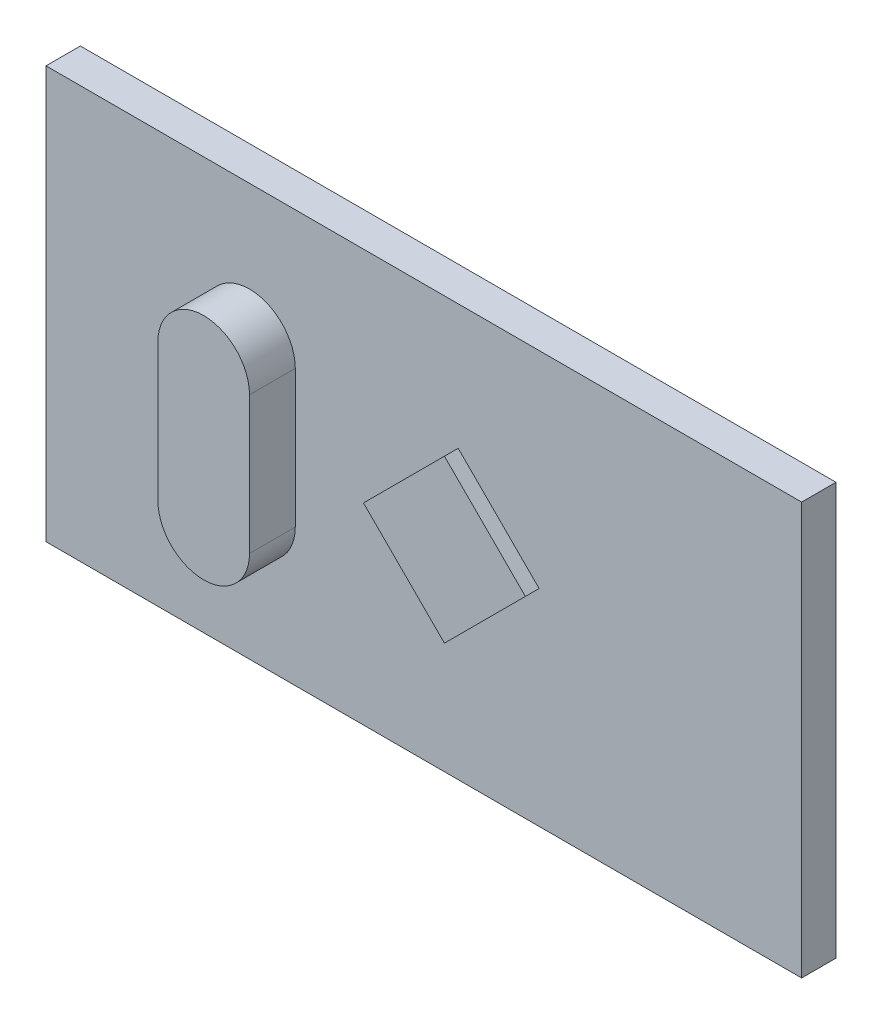
ISO-10303-21;
HEADER;
FILE_DESCRIPTION(('STEP AP214'),'2;1');
FILE_NAME('part.step','',(''),(''),'','','');
FILE_SCHEMA(('AUTOMOTIVE_DESIGN { 1 0 10303 214 1 1 1 1 }'));
ENDSEC;
DATA;
#1=APPLICATION_CONTEXT('core data for automotive mechanical design processes');
#2=APPLICATION_PROTOCOL_DEFINITION('international standard','automotive_design',2000,#1);
#3=PRODUCT_CONTEXT('',#1,'mechanical');
#4=PRODUCT('Part','Part','',(#3));
#5=PRODUCT_RELATED_PRODUCT_CATEGORY('part','',(#4));
#6=PRODUCT_DEFINITION_FORMATION('','',#4);
#7=PRODUCT_DEFINITION_CONTEXT('part definition',#1,'design');
#8=PRODUCT_DEFINITION('design','',#6,#7);
#9=PRODUCT_DEFINITION_SHAPE('','',#8);
#10=(LENGTH_UNIT() NAMED_UNIT(*) SI_UNIT(.MILLI.,.METRE.));
#11=(NAMED_UNIT(*) PLANE_ANGLE_UNIT() SI_UNIT($,.RADIAN.));
#12=(NAMED_UNIT(*) SI_UNIT($,.STERADIAN.) SOLID_ANGLE_UNIT());
#13=UNCERTAINTY_MEASURE_WITH_UNIT(LENGTH_MEASURE(1.E-05),#10,'distance_accuracy_value','');
#14=(GEOMETRIC_REPRESENTATION_CONTEXT(3) GLOBAL_UNCERTAINTY_ASSIGNED_CONTEXT((#13)) GLOBAL_UNIT_ASSIGNED_CONTEXT((#10,
#11,#12)) REPRESENTATION_CONTEXT('',''));
#15=CARTESIAN_POINT('',(0.,0.,0.));
#16=DIRECTION('',(0.,0.,1.));
#17=DIRECTION('',(1.,0.,0.));
#18=AXIS2_PLACEMENT_3D('',#15,#16,#17);
#19=CARTESIAN_POINT('',(0.,0.,1.5));
#20=DIRECTION('',(0.,0.,-1.));
#21=DIRECTION('',(-1.,0.,0.));
#22=AXIS2_PLACEMENT_3D('',#19,#20,#21);
#23=PLANE('',#22);
#24=DIRECTION('',(0.707106781186545,-0.70710678118655,0.));
#25=VECTOR('',#24,1.);
#26=CARTESIAN_POINT('',(18.,5.46446609406721,1.5));
#27=LINE('',#26,#25);
#28=CARTESIAN_POINT('',(14.4644660940672,8.99999999999996,1.5));
#29=VERTEX_POINT('',#28);
#30=CARTESIAN_POINT('',(18.,5.46446609406721,1.5));
#31=VERTEX_POINT('',#30);
#32=EDGE_CURVE('E145',#29,#31,#27,.T.);
#33=ORIENTED_EDGE('',*,*,#32,.F.);
#34=DIRECTION('',(-0.707106781186551,-0.707106781186544,0.));
#35=VECTOR('',#34,1.);
#36=CARTESIAN_POINT('',(14.4644660940672,8.99999999999996,1.5));
#37=LINE('',#36,#35);
#38=CARTESIAN_POINT('',(18.,12.5355339059327,1.5));
#39=VERTEX_POINT('',#38);
#40=EDGE_CURVE('E158',#39,#29,#37,.T.);
#41=ORIENTED_EDGE('',*,*,#40,.F.);
#42=DIRECTION('',(-0.707106781186544,0.70710678118655,0.));
#43=VECTOR('',#42,1.);
#44=CARTESIAN_POINT('',(18.,12.5355339059327,1.5));
#45=LINE('',#44,#43);
#46=CARTESIAN_POINT('',(21.5355339059327,8.99999999999993,1.5));
#47=VERTEX_POINT('',#46);
#48=EDGE_CURVE('E167',#47,#39,#45,.T.);
#49=ORIENTED_EDGE('',*,*,#48,.F.);
#50=DIRECTION('',(0.70710678118655,0.707106781186545,0.));
#51=VECTOR('',#50,1.);
#52=CARTESIAN_POINT('',(21.5355339059327,8.99999999999993,1.5));
#53=LINE('',#52,#51);
#54=EDGE_CURVE('E148',#31,#47,#53,.T.);
#55=ORIENTED_EDGE('',*,*,#54,.F.);
#56=EDGE_LOOP('',(#33,#41,#49,#55));
#57=FACE_BOUND('',#56,.T.);
#58=DIRECTION('',(0.,-1.,0.));
#59=VECTOR('',#58,1.);
#60=CARTESIAN_POINT('',(0.,0.,1.5));
#61=LINE('',#60,#59);
#62=CARTESIAN_POINT('',(0.,18.,1.5));
#63=VERTEX_POINT('',#62);
#64=CARTESIAN_POINT('',(0.,0.,1.5));
#65=VERTEX_POINT('',#64);
#66=EDGE_CURVE('E184',#63,#65,#61,.T.);
#67=ORIENTED_EDGE('',*,*,#66,.T.);
#68=DIRECTION('',(1.,0.,0.));
#69=VECTOR('',#68,1.);
#70=CARTESIAN_POINT('',(0.,0.,1.5));
#71=LINE('',#70,#69);
#72=CARTESIAN_POINT('',(33.,0.,1.5));
#73=VERTEX_POINT('',#72);
#74=EDGE_CURVE('E187',#65,#73,#71,.T.);
#75=ORIENTED_EDGE('',*,*,#74,.T.);
#76=DIRECTION('',(0.,1.,0.));
#77=VECTOR('',#76,1.);
#78=CARTESIAN_POINT('',(33.,0.,1.5));
#79=LINE('',#78,#77);
#80=CARTESIAN_POINT('',(33.,18.,1.5));
#81=VERTEX_POINT('',#80);
#82=EDGE_CURVE('E190',#73,#81,#79,.T.);
#83=ORIENTED_EDGE('',*,*,#82,.T.);
#84=DIRECTION('',(-1.,0.,0.));
#85=VECTOR('',#84,1.);
#86=CARTESIAN_POINT('',(0.,18.,1.5));
#87=LINE('',#86,#85);
#88=EDGE_CURVE('E192',#81,#63,#87,.T.);
#89=ORIENTED_EDGE('',*,*,#88,.T.);
#90=EDGE_LOOP('',(#67,#75,#83,#89));
#91=FACE_BOUND('',#90,.T.);
#92=CARTESIAN_POINT('',(8.88629291200393,6.,1.5));
#93=DIRECTION('',(0.,0.,1.));
#94=DIRECTION('',(1.,0.,0.));
#95=AXIS2_PLACEMENT_3D('',#92,#93,#94);
#96=CIRCLE('',#95,2.);
#97=CARTESIAN_POINT('',(6.88629291200393,6.,1.5));
#98=VERTEX_POINT('',#97);
#99=CARTESIAN_POINT('',(10.8862929120039,6.,1.5));
#100=VERTEX_POINT('',#99);
#101=EDGE_CURVE('E144',#98,#100,#96,.T.);
#102=ORIENTED_EDGE('',*,*,#101,.F.);
#103=DIRECTION('',(0.,-1.,0.));
#104=VECTOR('',#103,1.);
#105=CARTESIAN_POINT('',(6.88629291200393,6.,1.5));
#106=LINE('',#105,#104);
#107=CARTESIAN_POINT('',(6.88629291200393,12.,1.5));
#108=VERTEX_POINT('',#107);
#109=EDGE_CURVE('E141',#108,#98,#106,.T.);
#110=ORIENTED_EDGE('',*,*,#109,.F.);
#111=CARTESIAN_POINT('',(8.88629291200393,12.,1.5));
#112=DIRECTION('',(0.,0.,1.));
#113=DIRECTION('',(1.,0.,0.));
#114=AXIS2_PLACEMENT_3D('',#111,#112,#113);
#115=CIRCLE('',#114,2.);
#116=CARTESIAN_POINT('',(10.8862929120039,12.,1.5));
#117=VERTEX_POINT('',#116);
#118=EDGE_CURVE('E55',#117,#108,#115,.T.);
#119=ORIENTED_EDGE('',*,*,#118,.F.);
#120=DIRECTION('',(0.,1.,0.));
#121=VECTOR('',#120,1.);
#122=CARTESIAN_POINT('',(10.8862929120039,6.,1.5));
#123=LINE('',#122,#121);
#124=EDGE_CURVE('E50',#100,#117,#123,.T.);
#125=ORIENTED_EDGE('',*,*,#124,.F.);
#126=EDGE_LOOP('',(#102,#110,#119,#125));
#127=FACE_BOUND('',#126,.T.);
#128=ADVANCED_FACE('F35',(#57,#91,#127),#23,.F.);
#129=CARTESIAN_POINT('',(0.,0.,1.5));
#130=DIRECTION('',(1.,0.,0.));
#131=DIRECTION('',(0.,0.,-1.));
#132=AXIS2_PLACEMENT_3D('',#129,#130,#131);
#133=PLANE('',#132);
#134=DIRECTION('',(0.,-1.,0.));
#135=VECTOR('',#134,1.);
#136=CARTESIAN_POINT('',(0.,0.,0.));
#137=LINE('',#136,#135);
#138=CARTESIAN_POINT('',(0.,18.,0.));
#139=VERTEX_POINT('',#138);
#140=CARTESIAN_POINT('',(0.,0.,0.));
#141=VERTEX_POINT('',#140);
#142=EDGE_CURVE('E183',#139,#141,#137,.T.);
#143=ORIENTED_EDGE('',*,*,#142,.T.);
#144=DIRECTION('',(0.,0.,-1.));
#145=VECTOR('',#144,1.);
#146=CARTESIAN_POINT('',(0.,0.,1.5));
#147=LINE('',#146,#145);
#148=EDGE_CURVE('E11',#65,#141,#147,.T.);
#149=ORIENTED_EDGE('',*,*,#148,.F.);
#150=ORIENTED_EDGE('',*,*,#66,.F.);
#151=DIRECTION('',(0.,0.,-1.));
#152=VECTOR('',#151,1.);
#153=CARTESIAN_POINT('',(0.,18.,1.5));
#154=LINE('',#153,#152);
#155=EDGE_CURVE('E194',#63,#139,#154,.T.);
#156=ORIENTED_EDGE('',*,*,#155,.T.);
#157=EDGE_LOOP('',(#143,#149,#150,#156));
#158=FACE_BOUND('',#157,.T.);
#159=ADVANCED_FACE('F37',(#158),#133,.F.);
#160=CARTESIAN_POINT('',(0.,0.,1.5));
#161=DIRECTION('',(0.,1.,0.));
#162=DIRECTION('',(0.,0.,1.));
#163=AXIS2_PLACEMENT_3D('',#160,#161,#162);
#164=PLANE('',#163);
#165=DIRECTION('',(1.,0.,0.));
#166=VECTOR('',#165,1.);
#167=CARTESIAN_POINT('',(0.,0.,0.));
#168=LINE('',#167,#166);
#169=CARTESIAN_POINT('',(33.,0.,0.));
#170=VERTEX_POINT('',#169);
#171=EDGE_CURVE('E197',#141,#170,#168,.T.);
#172=ORIENTED_EDGE('',*,*,#171,.T.);
#173=DIRECTION('',(0.,0.,-1.));
#174=VECTOR('',#173,1.);
#175=CARTESIAN_POINT('',(33.,0.,1.5));
#176=LINE('',#175,#174);
#177=EDGE_CURVE('E43',#73,#170,#176,.T.);
#178=ORIENTED_EDGE('',*,*,#177,.F.);
#179=ORIENTED_EDGE('',*,*,#74,.F.);
#180=ORIENTED_EDGE('',*,*,#148,.T.);
#181=EDGE_LOOP('',(#172,#178,#179,#180));
#182=FACE_BOUND('',#181,.T.);
#183=ADVANCED_FACE('F226',(#182),#164,.F.);
#184=CARTESIAN_POINT('',(33.,0.,1.5));
#185=DIRECTION('',(-1.,0.,0.));
#186=DIRECTION('',(0.,0.,1.));
#187=AXIS2_PLACEMENT_3D('',#184,#185,#186);
#188=PLANE('',#187);
#189=DIRECTION('',(0.,1.,0.));
#190=VECTOR('',#189,1.);
#191=CARTESIAN_POINT('',(33.,0.,0.));
#192=LINE('',#191,#190);
#193=CARTESIAN_POINT('',(33.,18.,0.));
#194=VERTEX_POINT('',#193);
#195=EDGE_CURVE('E199',#170,#194,#192,.T.);
#196=ORIENTED_EDGE('',*,*,#195,.T.);
#197=DIRECTION('',(0.,0.,-1.));
#198=VECTOR('',#197,1.);
#199=CARTESIAN_POINT('',(33.,18.,1.5));
#200=LINE('',#199,#198);
#201=EDGE_CURVE('E204',#81,#194,#200,.T.);
#202=ORIENTED_EDGE('',*,*,#201,.F.);
#203=ORIENTED_EDGE('',*,*,#82,.F.);
#204=ORIENTED_EDGE('',*,*,#177,.T.);
#205=EDGE_LOOP('',(#196,#202,#203,#204));
#206=FACE_BOUND('',#205,.T.);
#207=ADVANCED_FACE('F211',(#206),#188,.F.);
#208=CARTESIAN_POINT('',(0.,18.,1.5));
#209=DIRECTION('',(0.,-1.,0.));
#210=DIRECTION('',(0.,0.,-1.));
#211=AXIS2_PLACEMENT_3D('',#208,#209,#210);
#212=PLANE('',#211);
#213=DIRECTION('',(-1.,0.,0.));
#214=VECTOR('',#213,1.);
#215=CARTESIAN_POINT('',(0.,18.,0.));
#216=LINE('',#215,#214);
#217=EDGE_CURVE('E188',#194,#139,#216,.T.);
#218=ORIENTED_EDGE('',*,*,#217,.T.);
#219=ORIENTED_EDGE('',*,*,#155,.F.);
#220=ORIENTED_EDGE('',*,*,#88,.F.);
#221=ORIENTED_EDGE('',*,*,#201,.T.);
#222=EDGE_LOOP('',(#218,#219,#220,#221));
#223=FACE_BOUND('',#222,.T.);
#224=ADVANCED_FACE('F220',(#223),#212,.F.);
#225=CARTESIAN_POINT('',(0.,0.,0.));
#226=DIRECTION('',(0.,0.,-1.));
#227=DIRECTION('',(-1.,0.,0.));
#228=AXIS2_PLACEMENT_3D('',#225,#226,#227);
#229=PLANE('',#228);
#230=ORIENTED_EDGE('',*,*,#142,.F.);
#231=ORIENTED_EDGE('',*,*,#217,.F.);
#232=ORIENTED_EDGE('',*,*,#195,.F.);
#233=ORIENTED_EDGE('',*,*,#171,.F.);
#234=EDGE_LOOP('',(#230,#231,#232,#233));
#235=FACE_BOUND('',#234,.T.);
#236=ADVANCED_FACE('F217',(#235),#229,.T.);
#237=CARTESIAN_POINT('',(18.,5.46446609406721,2.1));
#238=DIRECTION('',(0.70710678118655,0.707106781186545,0.));
#239=DIRECTION('',(-0.707106781186545,0.70710678118655,0.));
#240=AXIS2_PLACEMENT_3D('',#237,#238,#239);
#241=PLANE('',#240);
#242=ORIENTED_EDGE('',*,*,#32,.T.);
#243=DIRECTION('',(0.,0.,-1.));
#244=VECTOR('',#243,1.);
#245=CARTESIAN_POINT('',(18.,5.46446609406721,2.1));
#246=LINE('',#245,#244);
#247=CARTESIAN_POINT('',(18.,5.46446609406721,2.1));
#248=VERTEX_POINT('',#247);
#249=EDGE_CURVE('E180',#248,#31,#246,.T.);
#250=ORIENTED_EDGE('',*,*,#249,.F.);
#251=DIRECTION('',(0.707106781186545,-0.70710678118655,0.));
#252=VECTOR('',#251,1.);
#253=CARTESIAN_POINT('',(18.,5.46446609406721,2.1));
#254=LINE('',#253,#252);
#255=CARTESIAN_POINT('',(14.4644660940672,8.99999999999996,2.1));
#256=VERTEX_POINT('',#255);
#257=EDGE_CURVE('E154',#256,#248,#254,.T.);
#258=ORIENTED_EDGE('',*,*,#257,.F.);
#259=DIRECTION('',(0.,0.,-1.));
#260=VECTOR('',#259,1.);
#261=CARTESIAN_POINT('',(14.4644660940672,8.99999999999996,2.1));
#262=LINE('',#261,#260);
#263=EDGE_CURVE('E163',#256,#29,#262,.T.);
#264=ORIENTED_EDGE('',*,*,#263,.T.);
#265=EDGE_LOOP('',(#242,#250,#258,#264));
#266=FACE_BOUND('',#265,.T.);
#267=ADVANCED_FACE('F240',(#266),#241,.F.);
#268=CARTESIAN_POINT('',(21.5355339059327,8.99999999999993,2.1));
#269=DIRECTION('',(-0.707106781186545,0.70710678118655,0.));
#270=DIRECTION('',(-0.70710678118655,-0.707106781186545,0.));
#271=AXIS2_PLACEMENT_3D('',#268,#269,#270);
#272=PLANE('',#271);
#273=ORIENTED_EDGE('',*,*,#54,.T.);
#274=DIRECTION('',(0.,0.,-1.));
#275=VECTOR('',#274,1.);
#276=CARTESIAN_POINT('',(21.5355339059327,8.99999999999993,2.1));
#277=LINE('',#276,#275);
#278=CARTESIAN_POINT('',(21.5355339059327,8.99999999999993,2.1));
#279=VERTEX_POINT('',#278);
#280=EDGE_CURVE('E177',#279,#47,#277,.T.);
#281=ORIENTED_EDGE('',*,*,#280,.F.);
#282=DIRECTION('',(0.70710678118655,0.707106781186545,0.));
#283=VECTOR('',#282,1.);
#284=CARTESIAN_POINT('',(21.5355339059327,8.99999999999993,2.1));
#285=LINE('',#284,#283);
#286=EDGE_CURVE('E157',#248,#279,#285,.T.);
#287=ORIENTED_EDGE('',*,*,#286,.F.);
#288=ORIENTED_EDGE('',*,*,#249,.T.);
#289=EDGE_LOOP('',(#273,#281,#287,#288));
#290=FACE_BOUND('',#289,.T.);
#291=ADVANCED_FACE('F260',(#290),#272,.F.);
#292=CARTESIAN_POINT('',(18.,12.5355339059327,2.1));
#293=DIRECTION('',(-0.707106781186551,-0.707106781186545,0.));
#294=DIRECTION('',(0.707106781186545,-0.70710678118655,0.));
#295=AXIS2_PLACEMENT_3D('',#292,#293,#294);
#296=PLANE('',#295);
#297=ORIENTED_EDGE('',*,*,#48,.T.);
#298=DIRECTION('',(0.,0.,-1.));
#299=VECTOR('',#298,1.);
#300=CARTESIAN_POINT('',(18.,12.5355339059327,2.1));
#301=LINE('',#300,#299);
#302=CARTESIAN_POINT('',(18.,12.5355339059327,2.1));
#303=VERTEX_POINT('',#302);
#304=EDGE_CURVE('E174',#303,#39,#301,.T.);
#305=ORIENTED_EDGE('',*,*,#304,.F.);
#306=DIRECTION('',(-0.707106781186544,0.70710678118655,0.));
#307=VECTOR('',#306,1.);
#308=CARTESIAN_POINT('',(18.,12.5355339059327,2.1));
#309=LINE('',#308,#307);
#310=EDGE_CURVE('E160',#279,#303,#309,.T.);
#311=ORIENTED_EDGE('',*,*,#310,.F.);
#312=ORIENTED_EDGE('',*,*,#280,.T.);
#313=EDGE_LOOP('',(#297,#305,#311,#312));
#314=FACE_BOUND('',#313,.T.);
#315=ADVANCED_FACE('F267',(#314),#296,.F.);
#316=CARTESIAN_POINT('',(14.4644660940672,8.99999999999996,2.1));
#317=DIRECTION('',(0.707106781186544,-0.707106781186551,0.));
#318=DIRECTION('',(0.707106781186551,0.707106781186544,0.));
#319=AXIS2_PLACEMENT_3D('',#316,#317,#318);
#320=PLANE('',#319);
#321=ORIENTED_EDGE('',*,*,#40,.T.);
#322=ORIENTED_EDGE('',*,*,#263,.F.);
#323=DIRECTION('',(-0.707106781186551,-0.707106781186544,0.));
#324=VECTOR('',#323,1.);
#325=CARTESIAN_POINT('',(14.4644660940672,8.99999999999996,2.1));
#326=LINE('',#325,#324);
#327=EDGE_CURVE('E162',#303,#256,#326,.T.);
#328=ORIENTED_EDGE('',*,*,#327,.F.);
#329=ORIENTED_EDGE('',*,*,#304,.T.);
#330=EDGE_LOOP('',(#321,#322,#328,#329));
#331=FACE_BOUND('',#330,.T.);
#332=ADVANCED_FACE('F274',(#331),#320,.F.);
#333=CARTESIAN_POINT('',(0.,0.,2.1));
#334=DIRECTION('',(0.,0.,-1.));
#335=DIRECTION('',(-1.,0.,0.));
#336=AXIS2_PLACEMENT_3D('',#333,#334,#335);
#337=PLANE('',#336);
#338=ORIENTED_EDGE('',*,*,#257,.T.);
#339=ORIENTED_EDGE('',*,*,#286,.T.);
#340=ORIENTED_EDGE('',*,*,#310,.T.);
#341=ORIENTED_EDGE('',*,*,#327,.T.);
#342=EDGE_LOOP('',(#338,#339,#340,#341));
#343=FACE_BOUND('',#342,.T.);
#344=ADVANCED_FACE('F282',(#343),#337,.F.);
#345=CARTESIAN_POINT('',(8.88629291200393,6.,3.5));
#346=DIRECTION('',(0.,0.,-1.));
#347=DIRECTION('',(-1.,0.,0.));
#348=AXIS2_PLACEMENT_3D('',#345,#346,#347);
#349=CYLINDRICAL_SURFACE('',#348,2.);
#350=ORIENTED_EDGE('',*,*,#101,.T.);
#351=DIRECTION('',(0.,0.,-1.));
#352=VECTOR('',#351,1.);
#353=CARTESIAN_POINT('',(10.8862929120039,6.,3.5));
#354=LINE('',#353,#352);
#355=CARTESIAN_POINT('',(10.8862929120039,6.,3.5));
#356=VERTEX_POINT('',#355);
#357=EDGE_CURVE('E125',#356,#100,#354,.T.);
#358=ORIENTED_EDGE('',*,*,#357,.F.);
#359=CARTESIAN_POINT('',(8.88629291200393,6.,3.5));
#360=DIRECTION('',(0.,0.,1.));
#361=DIRECTION('',(1.,0.,0.));
#362=AXIS2_PLACEMENT_3D('',#359,#360,#361);
#363=CIRCLE('',#362,2.);
#364=CARTESIAN_POINT('',(6.88629291200393,6.,3.5));
#365=VERTEX_POINT('',#364);
#366=EDGE_CURVE('E132',#365,#356,#363,.T.);
#367=ORIENTED_EDGE('',*,*,#366,.F.);
#368=DIRECTION('',(0.,0.,-1.));
#369=VECTOR('',#368,1.);
#370=CARTESIAN_POINT('',(6.88629291200393,6.,3.5));
#371=LINE('',#370,#369);
#372=EDGE_CURVE('E384',#365,#98,#371,.T.);
#373=ORIENTED_EDGE('',*,*,#372,.T.);
#374=EDGE_LOOP('',(#350,#358,#367,#373));
#375=FACE_BOUND('',#374,.T.);
#376=ADVANCED_FACE('F143',(#375),#349,.T.);
#377=CARTESIAN_POINT('',(10.8862929120039,6.,3.5));
#378=DIRECTION('',(-1.,0.,0.));
#379=DIRECTION('',(0.,0.,1.));
#380=AXIS2_PLACEMENT_3D('',#377,#378,#379);
#381=PLANE('',#380);
#382=ORIENTED_EDGE('',*,*,#124,.T.);
#383=DIRECTION('',(0.,0.,-1.));
#384=VECTOR('',#383,1.);
#385=CARTESIAN_POINT('',(10.8862929120039,12.,3.5));
#386=LINE('',#385,#384);
#387=CARTESIAN_POINT('',(10.8862929120039,12.,3.5));
#388=VERTEX_POINT('',#387);
#389=EDGE_CURVE('E128',#388,#117,#386,.T.);
#390=ORIENTED_EDGE('',*,*,#389,.F.);
#391=DIRECTION('',(0.,1.,0.));
#392=VECTOR('',#391,1.);
#393=CARTESIAN_POINT('',(10.8862929120039,6.,3.5));
#394=LINE('',#393,#392);
#395=EDGE_CURVE('E121',#356,#388,#394,.T.);
#396=ORIENTED_EDGE('',*,*,#395,.F.);
#397=ORIENTED_EDGE('',*,*,#357,.T.);
#398=EDGE_LOOP('',(#382,#390,#396,#397));
#399=FACE_BOUND('',#398,.T.);
#400=ADVANCED_FACE('F123',(#399),#381,.F.);
#401=CARTESIAN_POINT('',(8.88629291200393,12.,3.5));
#402=DIRECTION('',(0.,0.,-1.));
#403=DIRECTION('',(-1.,0.,0.));
#404=AXIS2_PLACEMENT_3D('',#401,#402,#403);
#405=CYLINDRICAL_SURFACE('',#404,2.);
#406=ORIENTED_EDGE('',*,*,#118,.T.);
#407=DIRECTION('',(0.,0.,-1.));
#408=VECTOR('',#407,1.);
#409=CARTESIAN_POINT('',(6.88629291200393,12.,3.5));
#410=LINE('',#409,#408);
#411=CARTESIAN_POINT('',(6.88629291200393,12.,3.5));
#412=VERTEX_POINT('',#411);
#413=EDGE_CURVE('E150',#412,#108,#410,.T.);
#414=ORIENTED_EDGE('',*,*,#413,.F.);
#415=CARTESIAN_POINT('',(8.88629291200393,12.,3.5));
#416=DIRECTION('',(0.,0.,1.));
#417=DIRECTION('',(1.,0.,0.));
#418=AXIS2_PLACEMENT_3D('',#415,#416,#417);
#419=CIRCLE('',#418,2.);
#420=EDGE_CURVE('E131',#388,#412,#419,.T.);
#421=ORIENTED_EDGE('',*,*,#420,.F.);
#422=ORIENTED_EDGE('',*,*,#389,.T.);
#423=EDGE_LOOP('',(#406,#414,#421,#422));
#424=FACE_BOUND('',#423,.T.);
#425=ADVANCED_FACE('F303',(#424),#405,.T.);
#426=CARTESIAN_POINT('',(6.88629291200393,6.,3.5));
#427=DIRECTION('',(1.,0.,0.));
#428=DIRECTION('',(0.,0.,-1.));
#429=AXIS2_PLACEMENT_3D('',#426,#427,#428);
#430=PLANE('',#429);
#431=ORIENTED_EDGE('',*,*,#109,.T.);
#432=ORIENTED_EDGE('',*,*,#372,.F.);
#433=DIRECTION('',(0.,-1.,0.));
#434=VECTOR('',#433,1.);
#435=CARTESIAN_POINT('',(6.88629291200393,6.,3.5));
#436=LINE('',#435,#434);
#437=EDGE_CURVE('E137',#412,#365,#436,.T.);
#438=ORIENTED_EDGE('',*,*,#437,.F.);
#439=ORIENTED_EDGE('',*,*,#413,.T.);
#440=EDGE_LOOP('',(#431,#432,#438,#439));
#441=FACE_BOUND('',#440,.T.);
#442=ADVANCED_FACE('F310',(#441),#430,.F.);
#443=CARTESIAN_POINT('',(8.88629291200393,6.,3.5));
#444=DIRECTION('',(0.,0.,1.));
#445=DIRECTION('',(1.,0.,0.));
#446=AXIS2_PLACEMENT_3D('',#443,#444,#445);
#447=PLANE('',#446);
#448=ORIENTED_EDGE('',*,*,#366,.T.);
#449=ORIENTED_EDGE('',*,*,#395,.T.);
#450=ORIENTED_EDGE('',*,*,#420,.T.);
#451=ORIENTED_EDGE('',*,*,#437,.T.);
#452=EDGE_LOOP('',(#448,#449,#450,#451));
#453=FACE_BOUND('',#452,.T.);
#454=ADVANCED_FACE('F135',(#453),#447,.T.);
#455=CLOSED_SHELL('',(#128,#159,#183,#207,#224,#236,#267,#291,#315,#332,#344,#376,#400,#425,
#442,#454));
#456=MANIFOLD_SOLID_BREP('B2',#455);
#457=ADVANCED_BREP_SHAPE_REPRESENTATION('',(#18,#456),#14);
#458=SHAPE_DEFINITION_REPRESENTATION(#9,#457);
ENDSEC;
END-ISO-10303-21;
